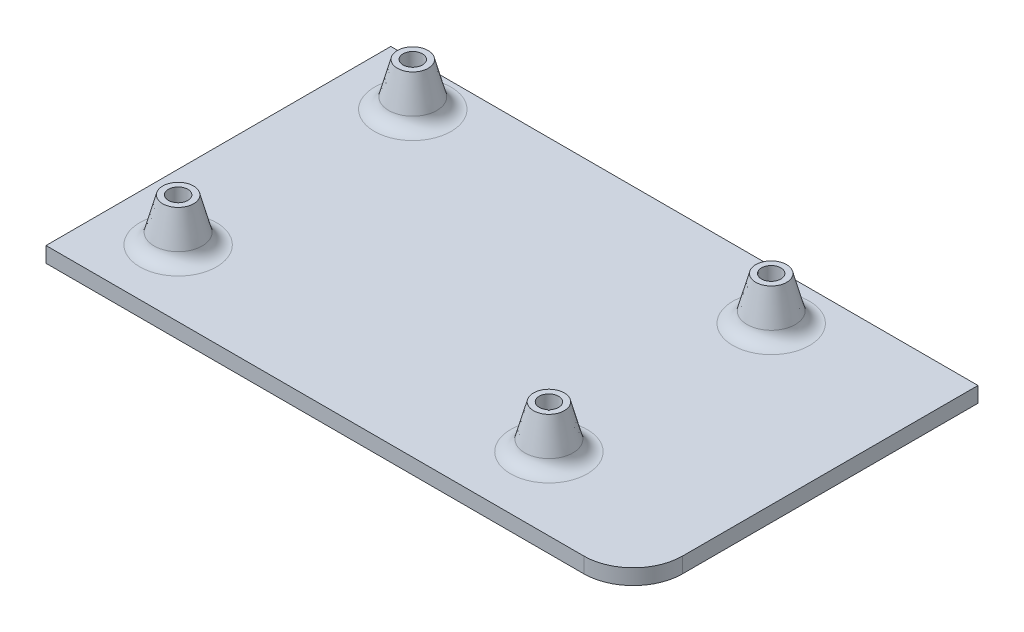
ISO-10303-21;
HEADER;
FILE_DESCRIPTION(('STEP AP214'),'2;1');
FILE_NAME('part.step','',(''),(''),'','','');
FILE_SCHEMA(('AUTOMOTIVE_DESIGN { 1 0 10303 214 1 1 1 1 }'));
ENDSEC;
DATA;
#1=APPLICATION_CONTEXT('core data for automotive mechanical design processes');
#2=APPLICATION_PROTOCOL_DEFINITION('international standard','automotive_design',2000,#1);
#3=PRODUCT_CONTEXT('',#1,'mechanical');
#4=PRODUCT('Part','Part','',(#3));
#5=PRODUCT_RELATED_PRODUCT_CATEGORY('part','',(#4));
#6=PRODUCT_DEFINITION_FORMATION('','',#4);
#7=PRODUCT_DEFINITION_CONTEXT('part definition',#1,'design');
#8=PRODUCT_DEFINITION('design','',#6,#7);
#9=PRODUCT_DEFINITION_SHAPE('','',#8);
#10=(LENGTH_UNIT() NAMED_UNIT(*) SI_UNIT(.MILLI.,.METRE.));
#11=(NAMED_UNIT(*) PLANE_ANGLE_UNIT() SI_UNIT($,.RADIAN.));
#12=(NAMED_UNIT(*) SI_UNIT($,.STERADIAN.) SOLID_ANGLE_UNIT());
#13=UNCERTAINTY_MEASURE_WITH_UNIT(LENGTH_MEASURE(1.E-05),#10,'distance_accuracy_value','');
#14=(GEOMETRIC_REPRESENTATION_CONTEXT(3) GLOBAL_UNCERTAINTY_ASSIGNED_CONTEXT((#13)) GLOBAL_UNIT_ASSIGNED_CONTEXT((#10,
#11,#12)) REPRESENTATION_CONTEXT('',''));
#15=CARTESIAN_POINT('',(0.,0.,0.));
#16=DIRECTION('',(0.,0.,1.));
#17=DIRECTION('',(1.,0.,0.));
#18=AXIS2_PLACEMENT_3D('',#15,#16,#17);
#19=CARTESIAN_POINT('',(0.,-4.318,113.03));
#20=DIRECTION('',(0.,0.,1.));
#21=DIRECTION('',(1.,0.,0.));
#22=AXIS2_PLACEMENT_3D('',#19,#20,#21);
#23=PLANE('',#22);
#24=DIRECTION('',(1.,0.,0.));
#25=VECTOR('',#24,1.);
#26=CARTESIAN_POINT('',(0.,0.,113.03));
#27=LINE('',#26,#25);
#28=CARTESIAN_POINT('',(-14.7284683385263,0.,113.03));
#29=VERTEX_POINT('',#28);
#30=CARTESIAN_POINT('',(95.885,0.,113.03));
#31=VERTEX_POINT('',#30);
#32=EDGE_CURVE('E197',#29,#31,#27,.T.);
#33=ORIENTED_EDGE('',*,*,#32,.F.);
#34=DIRECTION('',(0.,-1.,0.));
#35=VECTOR('',#34,1.);
#36=CARTESIAN_POINT('',(-14.7284683385263,-4.318,113.03));
#37=LINE('',#36,#35);
#38=CARTESIAN_POINT('',(-14.7284683385263,-3.175,113.03));
#39=VERTEX_POINT('',#38);
#40=EDGE_CURVE('E145',#29,#39,#37,.T.);
#41=ORIENTED_EDGE('',*,*,#40,.T.);
#42=DIRECTION('',(1.,0.,0.));
#43=VECTOR('',#42,1.);
#44=CARTESIAN_POINT('',(0.,-3.175,113.03));
#45=LINE('',#44,#43);
#46=CARTESIAN_POINT('',(95.885,-3.175,113.03));
#47=VERTEX_POINT('',#46);
#48=EDGE_CURVE('E132',#39,#47,#45,.T.);
#49=ORIENTED_EDGE('',*,*,#48,.T.);
#50=DIRECTION('',(0.,1.,0.));
#51=VECTOR('',#50,1.);
#52=CARTESIAN_POINT('',(95.885,-4.318,113.03));
#53=LINE('',#52,#51);
#54=EDGE_CURVE('E214',#47,#31,#53,.T.);
#55=ORIENTED_EDGE('',*,*,#54,.T.);
#56=EDGE_LOOP('',(#33,#41,#49,#55));
#57=FACE_BOUND('',#56,.T.);
#58=ADVANCED_FACE('F47',(#57),#23,.T.);
#59=CARTESIAN_POINT('',(0.,0.,0.));
#60=DIRECTION('',(0.,1.,0.));
#61=DIRECTION('',(0.,0.,1.));
#62=AXIS2_PLACEMENT_3D('',#59,#60,#61);
#63=PLANE('',#62);
#64=CARTESIAN_POINT('',(73.719801757794,0.,98.0390845199353));
#65=DIRECTION('',(0.,1.,0.));
#66=DIRECTION('',(0.,0.,1.));
#67=AXIS2_PLACEMENT_3D('',#64,#65,#66);
#68=CIRCLE('',#67,7.88871265935987);
#69=CARTESIAN_POINT('',(73.719801757794,0.,105.927797179295));
#70=VERTEX_POINT('',#69);
#71=EDGE_CURVE('E238',#70,#70,#68,.F.);
#72=ORIENTED_EDGE('',*,*,#71,.T.);
#73=EDGE_LOOP('',(#72));
#74=FACE_BOUND('',#73,.T.);
#75=CARTESIAN_POINT('',(-1.27019812220598,0.,99.3090845199353));
#76=DIRECTION('',(0.,1.,0.));
#77=DIRECTION('',(0.,0.,1.));
#78=AXIS2_PLACEMENT_3D('',#75,#76,#77);
#79=CIRCLE('',#78,7.88871265935986);
#80=CARTESIAN_POINT('',(-1.27019812220598,0.,107.197797179295));
#81=VERTEX_POINT('',#80);
#82=EDGE_CURVE('E241',#81,#81,#79,.F.);
#83=ORIENTED_EDGE('',*,*,#82,.T.);
#84=EDGE_LOOP('',(#83));
#85=FACE_BOUND('',#84,.T.);
#86=CARTESIAN_POINT('',(-1.27019812220599,0.,51.0490845199353));
#87=DIRECTION('',(0.,1.,0.));
#88=DIRECTION('',(0.,0.,1.));
#89=AXIS2_PLACEMENT_3D('',#86,#87,#88);
#90=CIRCLE('',#89,7.88871265935988);
#91=CARTESIAN_POINT('',(-1.27019812220599,0.,58.9377971792952));
#92=VERTEX_POINT('',#91);
#93=EDGE_CURVE('E247',#92,#92,#90,.F.);
#94=ORIENTED_EDGE('',*,*,#93,.T.);
#95=EDGE_LOOP('',(#94));
#96=FACE_BOUND('',#95,.T.);
#97=CARTESIAN_POINT('',(73.719801757794,0.,52.3190845199353));
#98=DIRECTION('',(0.,1.,0.));
#99=DIRECTION('',(0.,0.,1.));
#100=AXIS2_PLACEMENT_3D('',#97,#98,#99);
#101=CIRCLE('',#100,7.88871265935987);
#102=CARTESIAN_POINT('',(73.719801757794,0.,60.2077971792952));
#103=VERTEX_POINT('',#102);
#104=EDGE_CURVE('E254',#103,#103,#101,.F.);
#105=ORIENTED_EDGE('',*,*,#104,.T.);
#106=EDGE_LOOP('',(#105));
#107=FACE_BOUND('',#106,.T.);
#108=DIRECTION('',(-1.,0.,0.));
#109=VECTOR('',#108,1.);
#110=CARTESIAN_POINT('',(0.,0.,42.112925938971));
#111=LINE('',#110,#109);
#112=CARTESIAN_POINT('',(106.045,0.,42.112925938971));
#113=VERTEX_POINT('',#112);
#114=CARTESIAN_POINT('',(-14.7284683385263,0.,42.112925938971));
#115=VERTEX_POINT('',#114);
#116=EDGE_CURVE('E576',#113,#115,#111,.T.);
#117=ORIENTED_EDGE('',*,*,#116,.T.);
#118=DIRECTION('',(0.,0.,1.));
#119=VECTOR('',#118,1.);
#120=CARTESIAN_POINT('',(-14.7284683385263,0.,0.));
#121=LINE('',#120,#119);
#122=EDGE_CURVE('E124',#115,#29,#121,.T.);
#123=ORIENTED_EDGE('',*,*,#122,.T.);
#124=ORIENTED_EDGE('',*,*,#32,.T.);
#125=CARTESIAN_POINT('',(95.885,0.,102.87));
#126=DIRECTION('',(0.,1.,0.));
#127=DIRECTION('',(0.,0.,1.));
#128=AXIS2_PLACEMENT_3D('',#125,#126,#127);
#129=CIRCLE('',#128,10.16);
#130=CARTESIAN_POINT('',(106.045,0.,102.87));
#131=VERTEX_POINT('',#130);
#132=EDGE_CURVE('E208',#31,#131,#129,.T.);
#133=ORIENTED_EDGE('',*,*,#132,.T.);
#134=DIRECTION('',(0.,0.,-1.));
#135=VECTOR('',#134,1.);
#136=CARTESIAN_POINT('',(106.045,0.,0.));
#137=LINE('',#136,#135);
#138=EDGE_CURVE('E205',#131,#113,#137,.T.);
#139=ORIENTED_EDGE('',*,*,#138,.T.);
#140=EDGE_LOOP('',(#117,#123,#124,#133,#139));
#141=FACE_BOUND('',#140,.T.);
#142=ADVANCED_FACE('F281',(#74,#85,#96,#107,#141),#63,.T.);
#143=CARTESIAN_POINT('',(106.045,-4.318,0.));
#144=DIRECTION('',(1.,0.,0.));
#145=DIRECTION('',(0.,0.,-1.));
#146=AXIS2_PLACEMENT_3D('',#143,#144,#145);
#147=PLANE('',#146);
#148=DIRECTION('',(0.,0.,-1.));
#149=VECTOR('',#148,1.);
#150=CARTESIAN_POINT('',(106.045,-3.175,0.));
#151=LINE('',#150,#149);
#152=CARTESIAN_POINT('',(106.045,-3.175,102.87));
#153=VERTEX_POINT('',#152);
#154=CARTESIAN_POINT('',(106.045,-3.175,42.112925938971));
#155=VERTEX_POINT('',#154);
#156=EDGE_CURVE('E142',#153,#155,#151,.T.);
#157=ORIENTED_EDGE('',*,*,#156,.T.);
#158=DIRECTION('',(0.,1.,0.));
#159=VECTOR('',#158,1.);
#160=CARTESIAN_POINT('',(106.045,-4.318,42.112925938971));
#161=LINE('',#160,#159);
#162=EDGE_CURVE('E63',#155,#113,#161,.T.);
#163=ORIENTED_EDGE('',*,*,#162,.T.);
#164=ORIENTED_EDGE('',*,*,#138,.F.);
#165=DIRECTION('',(0.,1.,0.));
#166=VECTOR('',#165,1.);
#167=CARTESIAN_POINT('',(106.045,-4.318,102.87));
#168=LINE('',#167,#166);
#169=EDGE_CURVE('E207',#131,#153,#168,.F.);
#170=ORIENTED_EDGE('',*,*,#169,.T.);
#171=EDGE_LOOP('',(#157,#163,#164,#170));
#172=FACE_BOUND('',#171,.T.);
#173=ADVANCED_FACE('F286',(#172),#147,.T.);
#174=CARTESIAN_POINT('',(0.,-3.175,0.));
#175=DIRECTION('',(0.,-1.,0.));
#176=DIRECTION('',(0.,0.,-1.));
#177=AXIS2_PLACEMENT_3D('',#174,#175,#176);
#178=PLANE('',#177);
#179=ORIENTED_EDGE('',*,*,#48,.F.);
#180=DIRECTION('',(0.,0.,-1.));
#181=VECTOR('',#180,1.);
#182=CARTESIAN_POINT('',(-14.7284683385263,-3.175,0.));
#183=LINE('',#182,#181);
#184=CARTESIAN_POINT('',(-14.7284683385263,-3.175,42.112925938971));
#185=VERTEX_POINT('',#184);
#186=EDGE_CURVE('E12',#39,#185,#183,.T.);
#187=ORIENTED_EDGE('',*,*,#186,.T.);
#188=DIRECTION('',(1.,0.,0.));
#189=VECTOR('',#188,1.);
#190=CARTESIAN_POINT('',(0.,-3.175,42.112925938971));
#191=LINE('',#190,#189);
#192=EDGE_CURVE('E59',#185,#155,#191,.T.);
#193=ORIENTED_EDGE('',*,*,#192,.T.);
#194=ORIENTED_EDGE('',*,*,#156,.F.);
#195=CARTESIAN_POINT('',(95.885,-3.175,102.87));
#196=DIRECTION('',(0.,-1.,0.));
#197=DIRECTION('',(0.,0.,-1.));
#198=AXIS2_PLACEMENT_3D('',#195,#196,#197);
#199=CIRCLE('',#198,10.16);
#200=EDGE_CURVE('E134',#47,#153,#199,.F.);
#201=ORIENTED_EDGE('',*,*,#200,.F.);
#202=EDGE_LOOP('',(#179,#187,#193,#194,#201));
#203=FACE_BOUND('',#202,.T.);
#204=ADVANCED_FACE('F128',(#203),#178,.T.);
#205=CARTESIAN_POINT('',(95.885,-4.318,102.87));
#206=DIRECTION('',(0.,1.,0.));
#207=DIRECTION('',(0.,0.,1.));
#208=AXIS2_PLACEMENT_3D('',#205,#206,#207);
#209=CYLINDRICAL_SURFACE('',#208,10.16);
#210=ORIENTED_EDGE('',*,*,#54,.F.);
#211=ORIENTED_EDGE('',*,*,#200,.T.);
#212=ORIENTED_EDGE('',*,*,#169,.F.);
#213=ORIENTED_EDGE('',*,*,#132,.F.);
#214=EDGE_LOOP('',(#210,#211,#212,#213));
#215=FACE_BOUND('',#214,.T.);
#216=ADVANCED_FACE('F299',(#215),#209,.T.);
#217=CARTESIAN_POINT('',(-1.27019812220598,8.89,99.3090845199353));
#218=DIRECTION('',(0.,-1.,0.));
#219=DIRECTION('',(0.,0.,-1.));
#220=AXIS2_PLACEMENT_3D('',#217,#218,#219);
#221=CYLINDRICAL_SURFACE('',#220,1.9939);
#222=CARTESIAN_POINT('',(-1.27019812220598,8.89,99.3090845199353));
#223=DIRECTION('',(0.,1.,0.));
#224=DIRECTION('',(0.,0.,1.));
#225=AXIS2_PLACEMENT_3D('',#222,#223,#224);
#226=CIRCLE('',#225,1.9939);
#227=CARTESIAN_POINT('',(-1.27019812220598,8.89,101.302984519935));
#228=VERTEX_POINT('',#227);
#229=EDGE_CURVE('E155',#228,#228,#226,.T.);
#230=ORIENTED_EDGE('',*,*,#229,.T.);
#231=EDGE_LOOP('',(#230));
#232=FACE_BOUND('',#231,.T.);
#233=CARTESIAN_POINT('',(-1.27019812220598,0.,99.3090845199353));
#234=DIRECTION('',(0.,1.,0.));
#235=DIRECTION('',(0.,0.,1.));
#236=AXIS2_PLACEMENT_3D('',#233,#234,#235);
#237=CIRCLE('',#236,1.9939);
#238=CARTESIAN_POINT('',(-1.27019812220598,0.,101.302984519935));
#239=VERTEX_POINT('',#238);
#240=EDGE_CURVE('E217',#239,#239,#237,.F.);
#241=ORIENTED_EDGE('',*,*,#240,.T.);
#242=EDGE_LOOP('',(#241));
#243=FACE_BOUND('',#242,.T.);
#244=ADVANCED_FACE('F300',(#232,#243),#221,.F.);
#245=CARTESIAN_POINT('',(-1.27019812220598,0.,99.3090845199353));
#246=DIRECTION('',(0.,-1.,0.));
#247=DIRECTION('',(0.,0.,1.));
#248=AXIS2_PLACEMENT_3D('',#245,#246,#247);
#249=CONICAL_SURFACE('',#248,5.5499,0.26179938779915);
#250=CARTESIAN_POINT('',(-1.27019812220598,2.25911955052752,99.3090845199353));
#251=DIRECTION('',(0.,1.,0.));
#252=DIRECTION('',(0.,0.,1.));
#253=AXIS2_PLACEMENT_3D('',#250,#251,#252);
#254=CIRCLE('',#253,4.94457074083079);
#255=CARTESIAN_POINT('',(-1.27019812220598,2.25911955052752,104.253655260766));
#256=VERTEX_POINT('',#255);
#257=EDGE_CURVE('E259',#256,#256,#254,.T.);
#258=ORIENTED_EDGE('',*,*,#257,.T.);
#259=EDGE_LOOP('',(#258));
#260=FACE_BOUND('',#259,.T.);
#261=CARTESIAN_POINT('',(-1.27019812220598,8.89,99.3090845199353));
#262=DIRECTION('',(0.,1.,0.));
#263=DIRECTION('',(0.,0.,1.));
#264=AXIS2_PLACEMENT_3D('',#261,#262,#263);
#265=CIRCLE('',#264,3.16783167928731);
#266=CARTESIAN_POINT('',(-1.27019812220598,8.89,102.476916199223));
#267=VERTEX_POINT('',#266);
#268=EDGE_CURVE('E198',#267,#267,#265,.T.);
#269=ORIENTED_EDGE('',*,*,#268,.F.);
#270=EDGE_LOOP('',(#269));
#271=FACE_BOUND('',#270,.T.);
#272=ADVANCED_FACE('F314',(#260,#271),#249,.T.);
#273=CARTESIAN_POINT('',(0.,8.89,0.));
#274=DIRECTION('',(0.,1.,0.));
#275=DIRECTION('',(0.,0.,1.));
#276=AXIS2_PLACEMENT_3D('',#273,#274,#275);
#277=PLANE('',#276);
#278=ORIENTED_EDGE('',*,*,#229,.F.);
#279=EDGE_LOOP('',(#278));
#280=FACE_BOUND('',#279,.T.);
#281=ORIENTED_EDGE('',*,*,#268,.T.);
#282=EDGE_LOOP('',(#281));
#283=FACE_BOUND('',#282,.T.);
#284=ADVANCED_FACE('F317',(#280,#283),#277,.T.);
#285=ORIENTED_EDGE('',*,*,#240,.F.);
#286=EDGE_LOOP('',(#285));
#287=FACE_BOUND('',#286,.T.);
#288=ADVANCED_FACE('F312',(#287),#63,.T.);
#289=CARTESIAN_POINT('',(-1.27019812220599,0.,51.0490845199353));
#290=DIRECTION('',(0.,-1.,0.));
#291=DIRECTION('',(0.,0.,1.));
#292=AXIS2_PLACEMENT_3D('',#289,#290,#291);
#293=CONICAL_SURFACE('',#292,5.54990000000002,0.26179938779915);
#294=CARTESIAN_POINT('',(-1.27019812220599,2.25911955052751,51.0490845199353));
#295=DIRECTION('',(0.,-1.,0.));
#296=DIRECTION('',(0.,0.,-1.));
#297=AXIS2_PLACEMENT_3D('',#294,#295,#296);
#298=CIRCLE('',#297,4.94457074083081);
#299=CARTESIAN_POINT('',(-1.27019812220599,2.25911955052751,46.1045137791045));
#300=VERTEX_POINT('',#299);
#301=EDGE_CURVE('E258',#300,#300,#298,.F.);
#302=ORIENTED_EDGE('',*,*,#301,.T.);
#303=EDGE_LOOP('',(#302));
#304=FACE_BOUND('',#303,.T.);
#305=CARTESIAN_POINT('',(-1.27019812220599,8.89,51.0490845199353));
#306=DIRECTION('',(0.,1.,0.));
#307=DIRECTION('',(0.,0.,1.));
#308=AXIS2_PLACEMENT_3D('',#305,#306,#307);
#309=CIRCLE('',#308,3.16783167928733);
#310=CARTESIAN_POINT('',(-1.27019812220599,8.89,54.2169161992226));
#311=VERTEX_POINT('',#310);
#312=EDGE_CURVE('E151',#311,#311,#309,.F.);
#313=ORIENTED_EDGE('',*,*,#312,.T.);
#314=EDGE_LOOP('',(#313));
#315=FACE_BOUND('',#314,.T.);
#316=ADVANCED_FACE('F310',(#304,#315),#293,.T.);
#317=CARTESIAN_POINT('',(-1.27019812220599,8.89,51.0490845199353));
#318=DIRECTION('',(0.,-1.,0.));
#319=DIRECTION('',(0.,0.,-1.));
#320=AXIS2_PLACEMENT_3D('',#317,#318,#319);
#321=CYLINDRICAL_SURFACE('',#320,1.99390000000002);
#322=CARTESIAN_POINT('',(-1.27019812220599,8.89,51.0490845199353));
#323=DIRECTION('',(0.,1.,0.));
#324=DIRECTION('',(0.,0.,1.));
#325=AXIS2_PLACEMENT_3D('',#322,#323,#324);
#326=CIRCLE('',#325,1.99390000000002);
#327=CARTESIAN_POINT('',(-1.27019812220599,8.89,53.0429845199353));
#328=VERTEX_POINT('',#327);
#329=EDGE_CURVE('E146',#328,#328,#326,.F.);
#330=ORIENTED_EDGE('',*,*,#329,.F.);
#331=EDGE_LOOP('',(#330));
#332=FACE_BOUND('',#331,.T.);
#333=CARTESIAN_POINT('',(-1.27019812220599,0.,51.0490845199353));
#334=DIRECTION('',(0.,1.,0.));
#335=DIRECTION('',(0.,0.,1.));
#336=AXIS2_PLACEMENT_3D('',#333,#334,#335);
#337=CIRCLE('',#336,1.99390000000002);
#338=CARTESIAN_POINT('',(-1.27019812220599,0.,53.0429845199353));
#339=VERTEX_POINT('',#338);
#340=EDGE_CURVE('E157',#339,#339,#337,.F.);
#341=ORIENTED_EDGE('',*,*,#340,.T.);
#342=EDGE_LOOP('',(#341));
#343=FACE_BOUND('',#342,.T.);
#344=ADVANCED_FACE('F308',(#332,#343),#321,.F.);
#345=CARTESIAN_POINT('',(0.,8.89,0.));
#346=DIRECTION('',(0.,1.,0.));
#347=DIRECTION('',(0.,0.,1.));
#348=AXIS2_PLACEMENT_3D('',#345,#346,#347);
#349=PLANE('',#348);
#350=ORIENTED_EDGE('',*,*,#312,.F.);
#351=EDGE_LOOP('',(#350));
#352=FACE_BOUND('',#351,.T.);
#353=ORIENTED_EDGE('',*,*,#329,.T.);
#354=EDGE_LOOP('',(#353));
#355=FACE_BOUND('',#354,.T.);
#356=ADVANCED_FACE('F338',(#352,#355),#349,.T.);
#357=CARTESIAN_POINT('',(73.719801757794,8.89,52.3190845199353));
#358=DIRECTION('',(0.,-1.,0.));
#359=DIRECTION('',(0.,0.,-1.));
#360=AXIS2_PLACEMENT_3D('',#357,#358,#359);
#361=CYLINDRICAL_SURFACE('',#360,1.99389999999999);
#362=CARTESIAN_POINT('',(73.719801757794,8.89,52.3190845199353));
#363=DIRECTION('',(0.,1.,0.));
#364=DIRECTION('',(0.,0.,1.));
#365=AXIS2_PLACEMENT_3D('',#362,#363,#364);
#366=CIRCLE('',#365,1.99389999999999);
#367=CARTESIAN_POINT('',(73.719801757794,8.89,54.3129845199353));
#368=VERTEX_POINT('',#367);
#369=EDGE_CURVE('E162',#368,#368,#366,.T.);
#370=ORIENTED_EDGE('',*,*,#369,.T.);
#371=EDGE_LOOP('',(#370));
#372=FACE_BOUND('',#371,.T.);
#373=CARTESIAN_POINT('',(73.719801757794,0.,52.3190845199353));
#374=DIRECTION('',(0.,1.,0.));
#375=DIRECTION('',(0.,0.,1.));
#376=AXIS2_PLACEMENT_3D('',#373,#374,#375);
#377=CIRCLE('',#376,1.99389999999999);
#378=CARTESIAN_POINT('',(73.719801757794,0.,54.3129845199353));
#379=VERTEX_POINT('',#378);
#380=EDGE_CURVE('E218',#379,#379,#377,.F.);
#381=ORIENTED_EDGE('',*,*,#380,.T.);
#382=EDGE_LOOP('',(#381));
#383=FACE_BOUND('',#382,.T.);
#384=ADVANCED_FACE('F301',(#372,#383),#361,.F.);
#385=CARTESIAN_POINT('',(73.719801757794,0.,52.3190845199353));
#386=DIRECTION('',(0.,-1.,0.));
#387=DIRECTION('',(0.,0.,1.));
#388=AXIS2_PLACEMENT_3D('',#385,#386,#387);
#389=CONICAL_SURFACE('',#388,5.5499,0.26179938779915);
#390=CARTESIAN_POINT('',(73.719801757794,2.25911955052751,52.3190845199353));
#391=DIRECTION('',(0.,1.,0.));
#392=DIRECTION('',(0.,0.,1.));
#393=AXIS2_PLACEMENT_3D('',#390,#391,#392);
#394=CIRCLE('',#393,4.94457074083079);
#395=CARTESIAN_POINT('',(73.719801757794,2.25911955052751,57.2636552607661));
#396=VERTEX_POINT('',#395);
#397=EDGE_CURVE('E225',#396,#396,#394,.T.);
#398=ORIENTED_EDGE('',*,*,#397,.T.);
#399=EDGE_LOOP('',(#398));
#400=FACE_BOUND('',#399,.T.);
#401=CARTESIAN_POINT('',(73.719801757794,8.89,52.3190845199353));
#402=DIRECTION('',(0.,1.,0.));
#403=DIRECTION('',(0.,0.,1.));
#404=AXIS2_PLACEMENT_3D('',#401,#402,#403);
#405=CIRCLE('',#404,3.16783167928732);
#406=CARTESIAN_POINT('',(73.719801757794,8.89,55.4869161992226));
#407=VERTEX_POINT('',#406);
#408=EDGE_CURVE('E158',#407,#407,#405,.T.);
#409=ORIENTED_EDGE('',*,*,#408,.F.);
#410=EDGE_LOOP('',(#409));
#411=FACE_BOUND('',#410,.T.);
#412=ADVANCED_FACE('F303',(#400,#411),#389,.T.);
#413=CARTESIAN_POINT('',(0.,8.89,0.));
#414=DIRECTION('',(0.,1.,0.));
#415=DIRECTION('',(0.,0.,1.));
#416=AXIS2_PLACEMENT_3D('',#413,#414,#415);
#417=PLANE('',#416);
#418=ORIENTED_EDGE('',*,*,#369,.F.);
#419=EDGE_LOOP('',(#418));
#420=FACE_BOUND('',#419,.T.);
#421=ORIENTED_EDGE('',*,*,#408,.T.);
#422=EDGE_LOOP('',(#421));
#423=FACE_BOUND('',#422,.T.);
#424=ADVANCED_FACE('F305',(#420,#423),#417,.T.);
#425=ORIENTED_EDGE('',*,*,#380,.F.);
#426=EDGE_LOOP('',(#425));
#427=FACE_BOUND('',#426,.T.);
#428=ADVANCED_FACE('F355',(#427),#63,.T.);
#429=CARTESIAN_POINT('',(75.307301757794,8.89,0.));
#430=DIRECTION('',(-1.,0.,0.));
#431=DIRECTION('',(0.,0.,1.));
#432=AXIS2_PLACEMENT_3D('',#429,#430,#431);
#433=PLANE('',#432);
#434=DIRECTION('',(0.,0.,-1.));
#435=VECTOR('',#434,1.);
#436=CARTESIAN_POINT('',(75.307301757794,0.,0.));
#437=LINE('',#436,#435);
#438=CARTESIAN_POINT('',(75.307301757794,0.,99.6265845199353));
#439=VERTEX_POINT('',#438);
#440=CARTESIAN_POINT('',(75.307301757794,0.,99.2455176759783));
#441=VERTEX_POINT('',#440);
#442=EDGE_CURVE('E150',#439,#441,#437,.T.);
#443=ORIENTED_EDGE('',*,*,#442,.F.);
#444=DIRECTION('',(0.,-1.,0.));
#445=VECTOR('',#444,1.);
#446=CARTESIAN_POINT('',(75.307301757794,8.89,99.6265845199353));
#447=LINE('',#446,#445);
#448=CARTESIAN_POINT('',(75.307301757794,8.89,99.6265845199353));
#449=VERTEX_POINT('',#448);
#450=EDGE_CURVE('E163',#449,#439,#447,.T.);
#451=ORIENTED_EDGE('',*,*,#450,.F.);
#452=DIRECTION('',(0.,0.,-1.));
#453=VECTOR('',#452,1.);
#454=CARTESIAN_POINT('',(75.307301757794,8.89,0.));
#455=LINE('',#454,#453);
#456=CARTESIAN_POINT('',(75.307301757794,8.89,99.2455176759783));
#457=VERTEX_POINT('',#456);
#458=EDGE_CURVE('E167',#449,#457,#455,.T.);
#459=ORIENTED_EDGE('',*,*,#458,.T.);
#460=DIRECTION('',(0.,-1.,0.));
#461=VECTOR('',#460,1.);
#462=CARTESIAN_POINT('',(75.307301757794,8.89,99.2455176759783));
#463=LINE('',#462,#461);
#464=EDGE_CURVE('E184',#457,#441,#463,.T.);
#465=ORIENTED_EDGE('',*,*,#464,.T.);
#466=EDGE_LOOP('',(#443,#451,#459,#465));
#467=FACE_BOUND('',#466,.T.);
#468=ADVANCED_FACE('F364',(#467),#433,.T.);
#469=CARTESIAN_POINT('',(0.,8.89,99.6265845199353));
#470=DIRECTION('',(0.,0.,1.));
#471=DIRECTION('',(1.,0.,0.));
#472=AXIS2_PLACEMENT_3D('',#469,#470,#471);
#473=PLANE('',#472);
#474=DIRECTION('',(-1.,0.,0.));
#475=VECTOR('',#474,1.);
#476=CARTESIAN_POINT('',(0.,0.,99.6265845199353));
#477=LINE('',#476,#475);
#478=CARTESIAN_POINT('',(74.926234913837,0.,99.6265845199353));
#479=VERTEX_POINT('',#478);
#480=EDGE_CURVE('E72',#439,#479,#477,.T.);
#481=ORIENTED_EDGE('',*,*,#480,.T.);
#482=DIRECTION('',(0.,-1.,0.));
#483=VECTOR('',#482,1.);
#484=CARTESIAN_POINT('',(74.926234913837,8.89,99.6265845199353));
#485=LINE('',#484,#483);
#486=CARTESIAN_POINT('',(74.926234913837,8.89,99.6265845199353));
#487=VERTEX_POINT('',#486);
#488=EDGE_CURVE('E189',#487,#479,#485,.T.);
#489=ORIENTED_EDGE('',*,*,#488,.F.);
#490=DIRECTION('',(-1.,0.,0.));
#491=VECTOR('',#490,1.);
#492=CARTESIAN_POINT('',(0.,8.89,99.6265845199353));
#493=LINE('',#492,#491);
#494=EDGE_CURVE('E168',#449,#487,#493,.T.);
#495=ORIENTED_EDGE('',*,*,#494,.F.);
#496=ORIENTED_EDGE('',*,*,#450,.T.);
#497=EDGE_LOOP('',(#481,#489,#495,#496));
#498=FACE_BOUND('',#497,.T.);
#499=ADVANCED_FACE('F366',(#498),#473,.F.);
#500=CARTESIAN_POINT('',(73.719801757794,8.89,98.0390845199353));
#501=DIRECTION('',(0.,-1.,0.));
#502=DIRECTION('',(0.,0.,-1.));
#503=AXIS2_PLACEMENT_3D('',#500,#501,#502);
#504=CYLINDRICAL_SURFACE('',#503,1.99389999999999);
#505=CARTESIAN_POINT('',(73.719801757794,0.,98.0390845199353));
#506=DIRECTION('',(0.,1.,0.));
#507=DIRECTION('',(0.,0.,1.));
#508=AXIS2_PLACEMENT_3D('',#505,#506,#507);
#509=CIRCLE('',#508,1.99389999999999);
#510=EDGE_CURVE('E173',#441,#479,#509,.T.);
#511=ORIENTED_EDGE('',*,*,#510,.F.);
#512=ORIENTED_EDGE('',*,*,#464,.F.);
#513=CARTESIAN_POINT('',(73.719801757794,8.89,98.0390845199353));
#514=DIRECTION('',(0.,1.,0.));
#515=DIRECTION('',(0.,0.,1.));
#516=AXIS2_PLACEMENT_3D('',#513,#514,#515);
#517=CIRCLE('',#516,1.99389999999999);
#518=EDGE_CURVE('E175',#457,#487,#517,.T.);
#519=ORIENTED_EDGE('',*,*,#518,.T.);
#520=ORIENTED_EDGE('',*,*,#488,.T.);
#521=EDGE_LOOP('',(#511,#512,#519,#520));
#522=FACE_BOUND('',#521,.T.);
#523=ADVANCED_FACE('F323',(#522),#504,.F.);
#524=CARTESIAN_POINT('',(73.719801757794,0.,98.0390845199353));
#525=DIRECTION('',(0.,-1.,0.));
#526=DIRECTION('',(0.,0.,1.));
#527=AXIS2_PLACEMENT_3D('',#524,#525,#526);
#528=CONICAL_SURFACE('',#527,5.5499,0.26179938779915);
#529=CARTESIAN_POINT('',(73.719801757794,2.25911955052752,98.0390845199353));
#530=DIRECTION('',(0.,1.,0.));
#531=DIRECTION('',(0.,0.,1.));
#532=AXIS2_PLACEMENT_3D('',#529,#530,#531);
#533=CIRCLE('',#532,4.94457074083079);
#534=CARTESIAN_POINT('',(73.719801757794,2.25911955052752,102.983655260766));
#535=VERTEX_POINT('',#534);
#536=EDGE_CURVE('E119',#535,#535,#533,.T.);
#537=ORIENTED_EDGE('',*,*,#536,.T.);
#538=EDGE_LOOP('',(#537));
#539=FACE_BOUND('',#538,.T.);
#540=CARTESIAN_POINT('',(73.719801757794,8.89,98.0390845199353));
#541=DIRECTION('',(0.,1.,0.));
#542=DIRECTION('',(0.,0.,1.));
#543=AXIS2_PLACEMENT_3D('',#540,#541,#542);
#544=CIRCLE('',#543,3.16783167928731);
#545=CARTESIAN_POINT('',(73.719801757794,8.89,101.206916199223));
#546=VERTEX_POINT('',#545);
#547=EDGE_CURVE('E177',#546,#546,#544,.T.);
#548=ORIENTED_EDGE('',*,*,#547,.F.);
#549=EDGE_LOOP('',(#548));
#550=FACE_BOUND('',#549,.T.);
#551=ADVANCED_FACE('F268',(#539,#550),#528,.T.);
#552=CARTESIAN_POINT('',(0.,8.89,0.));
#553=DIRECTION('',(0.,1.,0.));
#554=DIRECTION('',(0.,0.,1.));
#555=AXIS2_PLACEMENT_3D('',#552,#553,#554);
#556=PLANE('',#555);
#557=ORIENTED_EDGE('',*,*,#458,.F.);
#558=ORIENTED_EDGE('',*,*,#494,.T.);
#559=ORIENTED_EDGE('',*,*,#518,.F.);
#560=EDGE_LOOP('',(#557,#558,#559));
#561=FACE_BOUND('',#560,.T.);
#562=ORIENTED_EDGE('',*,*,#547,.T.);
#563=EDGE_LOOP('',(#562));
#564=FACE_BOUND('',#563,.T.);
#565=ADVANCED_FACE('F318',(#561,#564),#556,.T.);
#566=ORIENTED_EDGE('',*,*,#442,.T.);
#567=ORIENTED_EDGE('',*,*,#510,.T.);
#568=ORIENTED_EDGE('',*,*,#480,.F.);
#569=EDGE_LOOP('',(#566,#567,#568));
#570=FACE_BOUND('',#569,.T.);
#571=ADVANCED_FACE('F294',(#570),#63,.T.);
#572=ORIENTED_EDGE('',*,*,#340,.F.);
#573=EDGE_LOOP('',(#572));
#574=FACE_BOUND('',#573,.T.);
#575=ADVANCED_FACE('F295',(#574),#63,.T.);
#576=CARTESIAN_POINT('',(73.719801757794,3.048,52.3190845199353));
#577=DIRECTION('',(0.,1.,0.));
#578=DIRECTION('',(0.,0.,1.));
#579=AXIS2_PLACEMENT_3D('',#576,#577,#578);
#580=TOROIDAL_SURFACE('',#579,7.88871265935987,3.048);
#581=ORIENTED_EDGE('',*,*,#104,.F.);
#582=EDGE_LOOP('',(#581));
#583=FACE_BOUND('',#582,.T.);
#584=ORIENTED_EDGE('',*,*,#397,.F.);
#585=EDGE_LOOP('',(#584));
#586=FACE_BOUND('',#585,.T.);
#587=ADVANCED_FACE('F324',(#583,#586),#580,.F.);
#588=CARTESIAN_POINT('',(-1.27019812220599,3.048,51.0490845199353));
#589=DIRECTION('',(0.,1.,0.));
#590=DIRECTION('',(0.,0.,1.));
#591=AXIS2_PLACEMENT_3D('',#588,#589,#590);
#592=TOROIDAL_SURFACE('',#591,7.88871265935988,3.048);
#593=ORIENTED_EDGE('',*,*,#93,.F.);
#594=EDGE_LOOP('',(#593));
#595=FACE_BOUND('',#594,.T.);
#596=ORIENTED_EDGE('',*,*,#301,.F.);
#597=EDGE_LOOP('',(#596));
#598=FACE_BOUND('',#597,.T.);
#599=ADVANCED_FACE('F279',(#595,#598),#592,.F.);
#600=CARTESIAN_POINT('',(-1.27019812220598,3.048,99.3090845199353));
#601=DIRECTION('',(0.,1.,0.));
#602=DIRECTION('',(0.,0.,1.));
#603=AXIS2_PLACEMENT_3D('',#600,#601,#602);
#604=TOROIDAL_SURFACE('',#603,7.88871265935986,3.048);
#605=ORIENTED_EDGE('',*,*,#82,.F.);
#606=EDGE_LOOP('',(#605));
#607=FACE_BOUND('',#606,.T.);
#608=ORIENTED_EDGE('',*,*,#257,.F.);
#609=EDGE_LOOP('',(#608));
#610=FACE_BOUND('',#609,.T.);
#611=ADVANCED_FACE('F275',(#607,#610),#604,.F.);
#612=CARTESIAN_POINT('',(73.719801757794,3.048,98.0390845199353));
#613=DIRECTION('',(0.,1.,0.));
#614=DIRECTION('',(0.,0.,1.));
#615=AXIS2_PLACEMENT_3D('',#612,#613,#614);
#616=TOROIDAL_SURFACE('',#615,7.88871265935987,3.048);
#617=ORIENTED_EDGE('',*,*,#71,.F.);
#618=EDGE_LOOP('',(#617));
#619=FACE_BOUND('',#618,.T.);
#620=ORIENTED_EDGE('',*,*,#536,.F.);
#621=EDGE_LOOP('',(#620));
#622=FACE_BOUND('',#621,.T.);
#623=ADVANCED_FACE('F51',(#619,#622),#616,.F.);
#624=CARTESIAN_POINT('',(-14.7284683385263,-25.4,42.112925938971));
#625=DIRECTION('',(-1.,0.,0.));
#626=DIRECTION('',(0.,0.,1.));
#627=AXIS2_PLACEMENT_3D('',#624,#625,#626);
#628=PLANE('',#627);
#629=DIRECTION('',(0.,1.,0.));
#630=VECTOR('',#629,1.);
#631=CARTESIAN_POINT('',(-14.7284683385263,-25.4,42.112925938971));
#632=LINE('',#631,#630);
#633=EDGE_CURVE('E112',#185,#115,#632,.T.);
#634=ORIENTED_EDGE('',*,*,#633,.F.);
#635=ORIENTED_EDGE('',*,*,#186,.F.);
#636=ORIENTED_EDGE('',*,*,#40,.F.);
#637=ORIENTED_EDGE('',*,*,#122,.F.);
#638=EDGE_LOOP('',(#634,#635,#636,#637));
#639=FACE_BOUND('',#638,.T.);
#640=ADVANCED_FACE('F125',(#639),#628,.T.);
#641=CARTESIAN_POINT('',(108.254573199301,-25.4,42.112925938971));
#642=DIRECTION('',(0.,0.,-1.));
#643=DIRECTION('',(-1.,0.,0.));
#644=AXIS2_PLACEMENT_3D('',#641,#642,#643);
#645=PLANE('',#644);
#646=ORIENTED_EDGE('',*,*,#162,.F.);
#647=ORIENTED_EDGE('',*,*,#192,.F.);
#648=ORIENTED_EDGE('',*,*,#633,.T.);
#649=ORIENTED_EDGE('',*,*,#116,.F.);
#650=EDGE_LOOP('',(#646,#647,#648,#649));
#651=FACE_BOUND('',#650,.T.);
#652=ADVANCED_FACE('F114',(#651),#645,.T.);
#653=CLOSED_SHELL('',(#58,#142,#173,#204,#216,#244,#272,#284,#288,#316,#344,#356,#384,#412,#424,
#428,#468,#499,#523,#551,#565,#571,#575,#587,#599,#611,#623,#640,#652));
#654=MANIFOLD_SOLID_BREP('B2',#653);
#655=ADVANCED_BREP_SHAPE_REPRESENTATION('',(#18,#654),#14);
#656=SHAPE_DEFINITION_REPRESENTATION(#9,#655);
ENDSEC;
END-ISO-10303-21;
